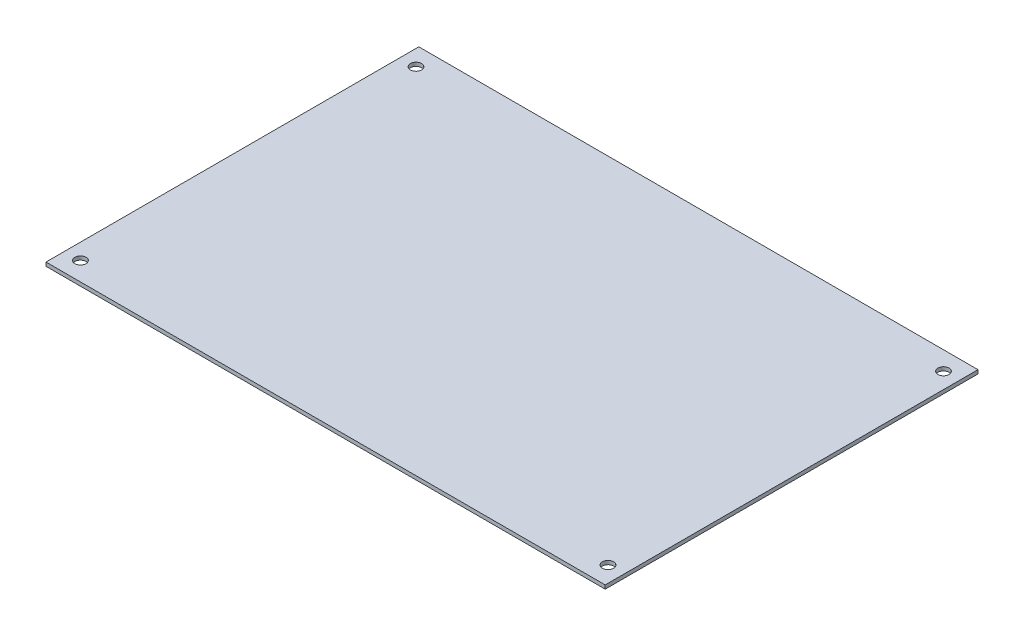
ISO-10303-21;
HEADER;
FILE_DESCRIPTION(('STEP AP214'),'2;1');
FILE_NAME('part.step','',(''),(''),'','','');
FILE_SCHEMA(('AUTOMOTIVE_DESIGN { 1 0 10303 214 1 1 1 1 }'));
ENDSEC;
DATA;
#1=APPLICATION_CONTEXT('core data for automotive mechanical design processes');
#2=APPLICATION_PROTOCOL_DEFINITION('international standard','automotive_design',2000,#1);
#3=PRODUCT_CONTEXT('',#1,'mechanical');
#4=PRODUCT('Part','Part','',(#3));
#5=PRODUCT_RELATED_PRODUCT_CATEGORY('part','',(#4));
#6=PRODUCT_DEFINITION_FORMATION('','',#4);
#7=PRODUCT_DEFINITION_CONTEXT('part definition',#1,'design');
#8=PRODUCT_DEFINITION('design','',#6,#7);
#9=PRODUCT_DEFINITION_SHAPE('','',#8);
#10=(LENGTH_UNIT() NAMED_UNIT(*) SI_UNIT(.MILLI.,.METRE.));
#11=(NAMED_UNIT(*) PLANE_ANGLE_UNIT() SI_UNIT($,.RADIAN.));
#12=(NAMED_UNIT(*) SI_UNIT($,.STERADIAN.) SOLID_ANGLE_UNIT());
#13=UNCERTAINTY_MEASURE_WITH_UNIT(LENGTH_MEASURE(1.E-05),#10,'distance_accuracy_value','');
#14=(GEOMETRIC_REPRESENTATION_CONTEXT(3) GLOBAL_UNCERTAINTY_ASSIGNED_CONTEXT((#13)) GLOBAL_UNIT_ASSIGNED_CONTEXT((#10,
#11,#12)) REPRESENTATION_CONTEXT('',''));
#15=CARTESIAN_POINT('',(0.,0.,0.));
#16=DIRECTION('',(0.,0.,1.));
#17=DIRECTION('',(1.,0.,0.));
#18=AXIS2_PLACEMENT_3D('',#15,#16,#17);
#19=CARTESIAN_POINT('',(-75.,-0.5,50.));
#20=DIRECTION('',(-1.,0.,0.));
#21=DIRECTION('',(0.,0.,1.));
#22=AXIS2_PLACEMENT_3D('',#19,#20,#21);
#23=PLANE('',#22);
#24=DIRECTION('',(0.,0.,1.));
#25=VECTOR('',#24,1.);
#26=CARTESIAN_POINT('',(-75.,0.5,50.));
#27=LINE('',#26,#25);
#28=CARTESIAN_POINT('',(-75.,0.5,-50.));
#29=VERTEX_POINT('',#28);
#30=CARTESIAN_POINT('',(-75.,0.5,50.));
#31=VERTEX_POINT('',#30);
#32=EDGE_CURVE('E98',#29,#31,#27,.T.);
#33=ORIENTED_EDGE('',*,*,#32,.F.);
#34=DIRECTION('',(0.,1.,0.));
#35=VECTOR('',#34,1.);
#36=CARTESIAN_POINT('',(-75.,-0.5,-50.));
#37=LINE('',#36,#35);
#38=CARTESIAN_POINT('',(-75.,-0.5,-50.));
#39=VERTEX_POINT('',#38);
#40=EDGE_CURVE('E11',#39,#29,#37,.T.);
#41=ORIENTED_EDGE('',*,*,#40,.F.);
#42=DIRECTION('',(0.,0.,1.));
#43=VECTOR('',#42,1.);
#44=CARTESIAN_POINT('',(-75.,-0.5,50.));
#45=LINE('',#44,#43);
#46=CARTESIAN_POINT('',(-75.,-0.5,50.));
#47=VERTEX_POINT('',#46);
#48=EDGE_CURVE('E91',#39,#47,#45,.T.);
#49=ORIENTED_EDGE('',*,*,#48,.T.);
#50=DIRECTION('',(0.,1.,0.));
#51=VECTOR('',#50,1.);
#52=CARTESIAN_POINT('',(-75.,-0.5,50.));
#53=LINE('',#52,#51);
#54=EDGE_CURVE('E36',#47,#31,#53,.T.);
#55=ORIENTED_EDGE('',*,*,#54,.T.);
#56=EDGE_LOOP('',(#33,#41,#49,#55));
#57=FACE_BOUND('',#56,.T.);
#58=ADVANCED_FACE('F33',(#57),#23,.T.);
#59=CARTESIAN_POINT('',(75.,-0.5,-50.));
#60=DIRECTION('',(0.,0.,-1.));
#61=DIRECTION('',(-1.,0.,0.));
#62=AXIS2_PLACEMENT_3D('',#59,#60,#61);
#63=PLANE('',#62);
#64=DIRECTION('',(-1.,0.,0.));
#65=VECTOR('',#64,1.);
#66=CARTESIAN_POINT('',(75.,0.5,-50.));
#67=LINE('',#66,#65);
#68=CARTESIAN_POINT('',(75.,0.5,-50.));
#69=VERTEX_POINT('',#68);
#70=EDGE_CURVE('E93',#69,#29,#67,.T.);
#71=ORIENTED_EDGE('',*,*,#70,.F.);
#72=DIRECTION('',(0.,1.,0.));
#73=VECTOR('',#72,1.);
#74=CARTESIAN_POINT('',(75.,-0.5,-50.));
#75=LINE('',#74,#73);
#76=CARTESIAN_POINT('',(75.,-0.5,-50.));
#77=VERTEX_POINT('',#76);
#78=EDGE_CURVE('E42',#77,#69,#75,.T.);
#79=ORIENTED_EDGE('',*,*,#78,.F.);
#80=DIRECTION('',(-1.,0.,0.));
#81=VECTOR('',#80,1.);
#82=CARTESIAN_POINT('',(75.,-0.5,-50.));
#83=LINE('',#82,#81);
#84=EDGE_CURVE('E88',#77,#39,#83,.T.);
#85=ORIENTED_EDGE('',*,*,#84,.T.);
#86=ORIENTED_EDGE('',*,*,#40,.T.);
#87=EDGE_LOOP('',(#71,#79,#85,#86));
#88=FACE_BOUND('',#87,.T.);
#89=ADVANCED_FACE('F109',(#88),#63,.T.);
#90=CARTESIAN_POINT('',(75.,-0.5,50.));
#91=DIRECTION('',(1.,0.,0.));
#92=DIRECTION('',(0.,0.,-1.));
#93=AXIS2_PLACEMENT_3D('',#90,#91,#92);
#94=PLANE('',#93);
#95=DIRECTION('',(0.,0.,-1.));
#96=VECTOR('',#95,1.);
#97=CARTESIAN_POINT('',(75.,0.5,50.));
#98=LINE('',#97,#96);
#99=CARTESIAN_POINT('',(75.,0.5,50.));
#100=VERTEX_POINT('',#99);
#101=EDGE_CURVE('E83',#100,#69,#98,.T.);
#102=ORIENTED_EDGE('',*,*,#101,.F.);
#103=DIRECTION('',(0.,1.,0.));
#104=VECTOR('',#103,1.);
#105=CARTESIAN_POINT('',(75.,-0.5,50.));
#106=LINE('',#105,#104);
#107=CARTESIAN_POINT('',(75.,-0.5,50.));
#108=VERTEX_POINT('',#107);
#109=EDGE_CURVE('E78',#108,#100,#106,.T.);
#110=ORIENTED_EDGE('',*,*,#109,.F.);
#111=DIRECTION('',(0.,0.,-1.));
#112=VECTOR('',#111,1.);
#113=CARTESIAN_POINT('',(75.,-0.5,50.));
#114=LINE('',#113,#112);
#115=EDGE_CURVE('E81',#108,#77,#114,.T.);
#116=ORIENTED_EDGE('',*,*,#115,.T.);
#117=ORIENTED_EDGE('',*,*,#78,.T.);
#118=EDGE_LOOP('',(#102,#110,#116,#117));
#119=FACE_BOUND('',#118,.T.);
#120=ADVANCED_FACE('F80',(#119),#94,.T.);
#121=CARTESIAN_POINT('',(75.,-0.5,50.));
#122=DIRECTION('',(0.,0.,1.));
#123=DIRECTION('',(1.,0.,0.));
#124=AXIS2_PLACEMENT_3D('',#121,#122,#123);
#125=PLANE('',#124);
#126=DIRECTION('',(1.,0.,0.));
#127=VECTOR('',#126,1.);
#128=CARTESIAN_POINT('',(75.,0.5,50.));
#129=LINE('',#128,#127);
#130=EDGE_CURVE('E101',#31,#100,#129,.T.);
#131=ORIENTED_EDGE('',*,*,#130,.F.);
#132=ORIENTED_EDGE('',*,*,#54,.F.);
#133=DIRECTION('',(1.,0.,0.));
#134=VECTOR('',#133,1.);
#135=CARTESIAN_POINT('',(75.,-0.5,50.));
#136=LINE('',#135,#134);
#137=EDGE_CURVE('E87',#47,#108,#136,.T.);
#138=ORIENTED_EDGE('',*,*,#137,.T.);
#139=ORIENTED_EDGE('',*,*,#109,.T.);
#140=EDGE_LOOP('',(#131,#132,#138,#139));
#141=FACE_BOUND('',#140,.T.);
#142=ADVANCED_FACE('F90',(#141),#125,.T.);
#143=CARTESIAN_POINT('',(0.,-0.5,0.));
#144=DIRECTION('',(0.,1.,0.));
#145=DIRECTION('',(0.,0.,1.));
#146=AXIS2_PLACEMENT_3D('',#143,#144,#145);
#147=PLANE('',#146);
#148=CARTESIAN_POINT('',(-70.75,-0.5,45.));
#149=DIRECTION('',(0.,1.,0.));
#150=DIRECTION('',(0.,0.,1.));
#151=AXIS2_PLACEMENT_3D('',#148,#149,#150);
#152=CIRCLE('',#151,1.5);
#153=CARTESIAN_POINT('',(-70.75,-0.5,46.5));
#154=VERTEX_POINT('',#153);
#155=EDGE_CURVE('E163',#154,#154,#152,.T.);
#156=ORIENTED_EDGE('',*,*,#155,.T.);
#157=EDGE_LOOP('',(#156));
#158=FACE_BOUND('',#157,.T.);
#159=CARTESIAN_POINT('',(70.75,-0.5,-45.));
#160=DIRECTION('',(0.,1.,0.));
#161=DIRECTION('',(0.,0.,1.));
#162=AXIS2_PLACEMENT_3D('',#159,#160,#161);
#163=CIRCLE('',#162,1.5);
#164=CARTESIAN_POINT('',(70.75,-0.5,-43.5));
#165=VERTEX_POINT('',#164);
#166=EDGE_CURVE('E156',#165,#165,#163,.T.);
#167=ORIENTED_EDGE('',*,*,#166,.T.);
#168=EDGE_LOOP('',(#167));
#169=FACE_BOUND('',#168,.T.);
#170=CARTESIAN_POINT('',(70.75,-0.5,45.));
#171=DIRECTION('',(0.,1.,0.));
#172=DIRECTION('',(0.,0.,1.));
#173=AXIS2_PLACEMENT_3D('',#170,#171,#172);
#174=CIRCLE('',#173,1.5);
#175=CARTESIAN_POINT('',(70.75,-0.5,46.5));
#176=VERTEX_POINT('',#175);
#177=EDGE_CURVE('E151',#176,#176,#174,.T.);
#178=ORIENTED_EDGE('',*,*,#177,.T.);
#179=EDGE_LOOP('',(#178));
#180=FACE_BOUND('',#179,.T.);
#181=CARTESIAN_POINT('',(-70.75,-0.5,-45.));
#182=DIRECTION('',(0.,1.,0.));
#183=DIRECTION('',(0.,0.,1.));
#184=AXIS2_PLACEMENT_3D('',#181,#182,#183);
#185=CIRCLE('',#184,1.5);
#186=CARTESIAN_POINT('',(-70.75,-0.5,-43.5));
#187=VERTEX_POINT('',#186);
#188=EDGE_CURVE('E102',#187,#187,#185,.T.);
#189=ORIENTED_EDGE('',*,*,#188,.T.);
#190=EDGE_LOOP('',(#189));
#191=FACE_BOUND('',#190,.T.);
#192=ORIENTED_EDGE('',*,*,#48,.F.);
#193=ORIENTED_EDGE('',*,*,#84,.F.);
#194=ORIENTED_EDGE('',*,*,#115,.F.);
#195=ORIENTED_EDGE('',*,*,#137,.F.);
#196=EDGE_LOOP('',(#192,#193,#194,#195));
#197=FACE_BOUND('',#196,.T.);
#198=ADVANCED_FACE('F86',(#158,#169,#180,#191,#197),#147,.F.);
#199=CARTESIAN_POINT('',(0.,0.5,0.));
#200=DIRECTION('',(0.,1.,0.));
#201=DIRECTION('',(0.,0.,1.));
#202=AXIS2_PLACEMENT_3D('',#199,#200,#201);
#203=PLANE('',#202);
#204=CARTESIAN_POINT('',(-70.75,0.5,45.));
#205=DIRECTION('',(0.,1.,0.));
#206=DIRECTION('',(0.,0.,1.));
#207=AXIS2_PLACEMENT_3D('',#204,#205,#206);
#208=CIRCLE('',#207,1.5);
#209=CARTESIAN_POINT('',(-70.75,0.5,46.5));
#210=VERTEX_POINT('',#209);
#211=EDGE_CURVE('E165',#210,#210,#208,.T.);
#212=ORIENTED_EDGE('',*,*,#211,.F.);
#213=EDGE_LOOP('',(#212));
#214=FACE_BOUND('',#213,.T.);
#215=CARTESIAN_POINT('',(70.75,0.5,-45.));
#216=DIRECTION('',(0.,1.,0.));
#217=DIRECTION('',(0.,0.,1.));
#218=AXIS2_PLACEMENT_3D('',#215,#216,#217);
#219=CIRCLE('',#218,1.5);
#220=CARTESIAN_POINT('',(70.75,0.5,-43.5));
#221=VERTEX_POINT('',#220);
#222=EDGE_CURVE('E159',#221,#221,#219,.T.);
#223=ORIENTED_EDGE('',*,*,#222,.F.);
#224=EDGE_LOOP('',(#223));
#225=FACE_BOUND('',#224,.T.);
#226=CARTESIAN_POINT('',(70.75,0.5,45.));
#227=DIRECTION('',(0.,1.,0.));
#228=DIRECTION('',(0.,0.,1.));
#229=AXIS2_PLACEMENT_3D('',#226,#227,#228);
#230=CIRCLE('',#229,1.5);
#231=CARTESIAN_POINT('',(70.75,0.5,46.5));
#232=VERTEX_POINT('',#231);
#233=EDGE_CURVE('E154',#232,#232,#230,.T.);
#234=ORIENTED_EDGE('',*,*,#233,.F.);
#235=EDGE_LOOP('',(#234));
#236=FACE_BOUND('',#235,.T.);
#237=CARTESIAN_POINT('',(-70.75,0.5,-45.));
#238=DIRECTION('',(0.,1.,0.));
#239=DIRECTION('',(0.,0.,1.));
#240=AXIS2_PLACEMENT_3D('',#237,#238,#239);
#241=CIRCLE('',#240,1.5);
#242=CARTESIAN_POINT('',(-70.75,0.5,-43.5));
#243=VERTEX_POINT('',#242);
#244=EDGE_CURVE('E167',#243,#243,#241,.T.);
#245=ORIENTED_EDGE('',*,*,#244,.F.);
#246=EDGE_LOOP('',(#245));
#247=FACE_BOUND('',#246,.T.);
#248=ORIENTED_EDGE('',*,*,#32,.T.);
#249=ORIENTED_EDGE('',*,*,#130,.T.);
#250=ORIENTED_EDGE('',*,*,#101,.T.);
#251=ORIENTED_EDGE('',*,*,#70,.T.);
#252=EDGE_LOOP('',(#248,#249,#250,#251));
#253=FACE_BOUND('',#252,.T.);
#254=ADVANCED_FACE('F108',(#214,#225,#236,#247,#253),#203,.T.);
#255=CARTESIAN_POINT('',(-70.75,-0.5,-45.));
#256=DIRECTION('',(0.,1.,0.));
#257=DIRECTION('',(0.,0.,1.));
#258=AXIS2_PLACEMENT_3D('',#255,#256,#257);
#259=CYLINDRICAL_SURFACE('',#258,1.5);
#260=ORIENTED_EDGE('',*,*,#188,.F.);
#261=EDGE_LOOP('',(#260));
#262=FACE_BOUND('',#261,.T.);
#263=ORIENTED_EDGE('',*,*,#244,.T.);
#264=EDGE_LOOP('',(#263));
#265=FACE_BOUND('',#264,.T.);
#266=ADVANCED_FACE('F127',(#262,#265),#259,.F.);
#267=CARTESIAN_POINT('',(70.75,-0.5,45.));
#268=DIRECTION('',(0.,1.,0.));
#269=DIRECTION('',(0.,0.,1.));
#270=AXIS2_PLACEMENT_3D('',#267,#268,#269);
#271=CYLINDRICAL_SURFACE('',#270,1.5);
#272=ORIENTED_EDGE('',*,*,#177,.F.);
#273=EDGE_LOOP('',(#272));
#274=FACE_BOUND('',#273,.T.);
#275=ORIENTED_EDGE('',*,*,#233,.T.);
#276=EDGE_LOOP('',(#275));
#277=FACE_BOUND('',#276,.T.);
#278=ADVANCED_FACE('F134',(#274,#277),#271,.F.);
#279=CARTESIAN_POINT('',(70.75,-0.5,-45.));
#280=DIRECTION('',(0.,1.,0.));
#281=DIRECTION('',(0.,0.,1.));
#282=AXIS2_PLACEMENT_3D('',#279,#280,#281);
#283=CYLINDRICAL_SURFACE('',#282,1.5);
#284=ORIENTED_EDGE('',*,*,#166,.F.);
#285=EDGE_LOOP('',(#284));
#286=FACE_BOUND('',#285,.T.);
#287=ORIENTED_EDGE('',*,*,#222,.T.);
#288=EDGE_LOOP('',(#287));
#289=FACE_BOUND('',#288,.T.);
#290=ADVANCED_FACE('F136',(#286,#289),#283,.F.);
#291=CARTESIAN_POINT('',(-70.75,-0.5,45.));
#292=DIRECTION('',(0.,1.,0.));
#293=DIRECTION('',(0.,0.,1.));
#294=AXIS2_PLACEMENT_3D('',#291,#292,#293);
#295=CYLINDRICAL_SURFACE('',#294,1.5);
#296=ORIENTED_EDGE('',*,*,#155,.F.);
#297=EDGE_LOOP('',(#296));
#298=FACE_BOUND('',#297,.T.);
#299=ORIENTED_EDGE('',*,*,#211,.T.);
#300=EDGE_LOOP('',(#299));
#301=FACE_BOUND('',#300,.T.);
#302=ADVANCED_FACE('F139',(#298,#301),#295,.F.);
#303=CLOSED_SHELL('',(#58,#89,#120,#142,#198,#254,#266,#278,#290,#302));
#304=MANIFOLD_SOLID_BREP('B2',#303);
#305=ADVANCED_BREP_SHAPE_REPRESENTATION('',(#18,#304),#14);
#306=SHAPE_DEFINITION_REPRESENTATION(#9,#305);
ENDSEC;
END-ISO-10303-21;
